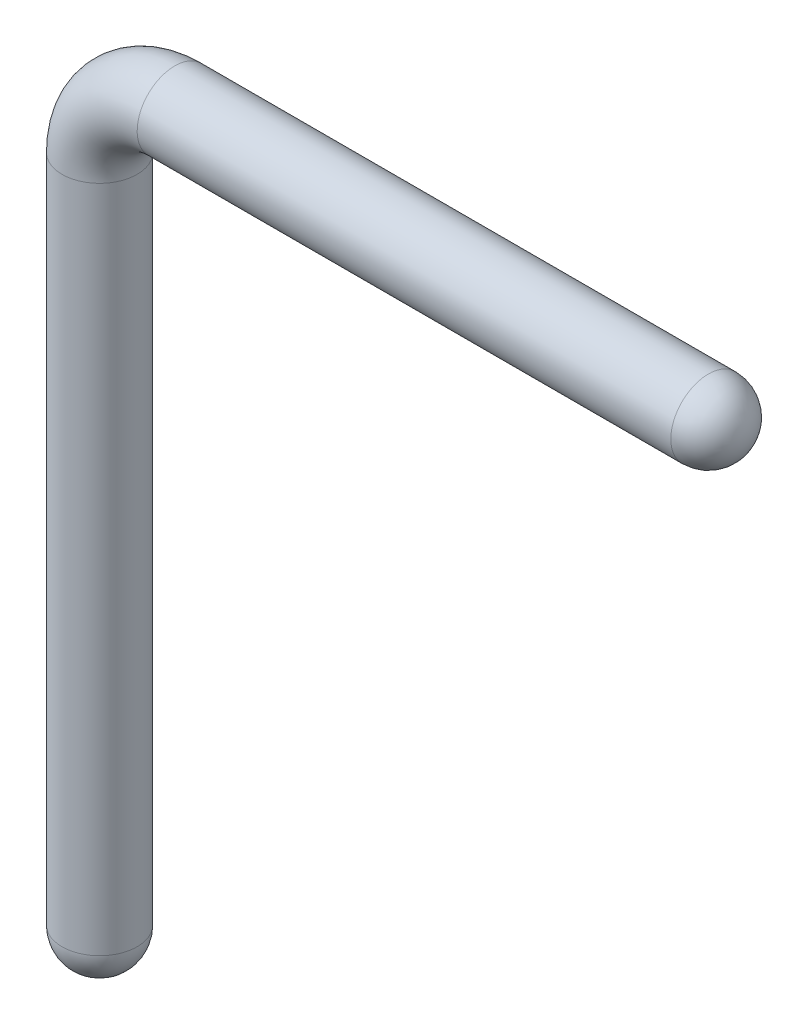
ISO-10303-21;
HEADER;
FILE_DESCRIPTION(('STEP AP214'),'2;1');
FILE_NAME('part.step','',(''),(''),'','','');
FILE_SCHEMA(('AUTOMOTIVE_DESIGN { 1 0 10303 214 1 1 1 1 }'));
ENDSEC;
DATA;
#1=APPLICATION_CONTEXT('core data for automotive mechanical design processes');
#2=APPLICATION_PROTOCOL_DEFINITION('international standard','automotive_design',2000,#1);
#3=PRODUCT_CONTEXT('',#1,'mechanical');
#4=PRODUCT('Part','Part','',(#3));
#5=PRODUCT_RELATED_PRODUCT_CATEGORY('part','',(#4));
#6=PRODUCT_DEFINITION_FORMATION('','',#4);
#7=PRODUCT_DEFINITION_CONTEXT('part definition',#1,'design');
#8=PRODUCT_DEFINITION('design','',#6,#7);
#9=PRODUCT_DEFINITION_SHAPE('','',#8);
#10=(LENGTH_UNIT() NAMED_UNIT(*) SI_UNIT(.MILLI.,.METRE.));
#11=(NAMED_UNIT(*) PLANE_ANGLE_UNIT() SI_UNIT($,.RADIAN.));
#12=(NAMED_UNIT(*) SI_UNIT($,.STERADIAN.) SOLID_ANGLE_UNIT());
#13=UNCERTAINTY_MEASURE_WITH_UNIT(LENGTH_MEASURE(1.E-05),#10,'distance_accuracy_value','');
#14=(GEOMETRIC_REPRESENTATION_CONTEXT(3) GLOBAL_UNCERTAINTY_ASSIGNED_CONTEXT((#13)) GLOBAL_UNIT_ASSIGNED_CONTEXT((#10,
#11,#12)) REPRESENTATION_CONTEXT('',''));
#15=CARTESIAN_POINT('',(0.,0.,0.));
#16=DIRECTION('',(0.,0.,1.));
#17=DIRECTION('',(1.,0.,0.));
#18=AXIS2_PLACEMENT_3D('',#15,#16,#17);
#19=CARTESIAN_POINT('',(0.,0.,0.));
#20=DIRECTION('',(0.,1.,0.));
#21=DIRECTION('',(0.,0.,1.));
#22=AXIS2_PLACEMENT_3D('',#19,#20,#21);
#23=CYLINDRICAL_SURFACE('',#22,0.25);
#24=CARTESIAN_POINT('',(0.,0.25,0.));
#25=DIRECTION('',(0.,1.,0.));
#26=DIRECTION('',(0.,0.,1.));
#27=AXIS2_PLACEMENT_3D('',#24,#25,#26);
#28=CIRCLE('',#27,0.25);
#29=CARTESIAN_POINT('',(0.,0.25,0.25));
#30=VERTEX_POINT('',#29);
#31=EDGE_CURVE('E45',#30,#30,#28,.T.);
#32=ORIENTED_EDGE('',*,*,#31,.T.);
#33=EDGE_LOOP('',(#32));
#34=FACE_BOUND('',#33,.T.);
#35=CARTESIAN_POINT('',(0.,4.7,0.));
#36=DIRECTION('',(0.,1.,0.));
#37=DIRECTION('',(0.,0.,1.));
#38=AXIS2_PLACEMENT_3D('',#35,#36,#37);
#39=CIRCLE('',#38,0.25);
#40=CARTESIAN_POINT('',(-0.25,4.7,0.));
#41=VERTEX_POINT('',#40);
#42=EDGE_CURVE('E55',#41,#41,#39,.T.);
#43=ORIENTED_EDGE('',*,*,#42,.F.);
#44=EDGE_LOOP('',(#43));
#45=FACE_BOUND('',#44,.T.);
#46=ADVANCED_FACE('F37',(#34,#45),#23,.T.);
#47=CARTESIAN_POINT('',(0.5,4.7,0.));
#48=DIRECTION('',(0.,0.,-1.));
#49=DIRECTION('',(-1.,0.,0.));
#50=AXIS2_PLACEMENT_3D('',#47,#48,#49);
#51=TOROIDAL_SURFACE('',#50,0.5,0.25);
#52=CARTESIAN_POINT('',(0.499999999999999,5.2,0.));
#53=DIRECTION('',(1.,0.,0.));
#54=DIRECTION('',(0.,0.,1.));
#55=AXIS2_PLACEMENT_3D('',#52,#53,#54);
#56=CIRCLE('',#55,0.25);
#57=CARTESIAN_POINT('',(0.499999999999999,5.45,0.));
#58=VERTEX_POINT('',#57);
#59=EDGE_CURVE('E50',#58,#58,#56,.T.);
#60=CARTESIAN_POINT('',(0.5,4.7,0.));
#61=DIRECTION('',(0.,0.,-1.));
#62=DIRECTION('',(-1.,0.,0.));
#63=AXIS2_PLACEMENT_3D('',#60,#61,#62);
#64=CIRCLE('',#63,0.75);
#65=EDGE_CURVE('',#41,#58,#64,.T.);
#66=ORIENTED_EDGE('',*,*,#42,.T.);
#67=ORIENTED_EDGE('',*,*,#59,.F.);
#68=ORIENTED_EDGE('',*,*,#65,.T.);
#69=ORIENTED_EDGE('',*,*,#65,.F.);
#70=EDGE_LOOP('',(#66,#68,#67,#69));
#71=FACE_BOUND('',#70,.T.);
#72=ADVANCED_FACE('F62',(#71),#51,.T.);
#73=CARTESIAN_POINT('',(0.5,5.2,0.));
#74=DIRECTION('',(1.,0.,0.));
#75=DIRECTION('',(0.,0.,-1.));
#76=AXIS2_PLACEMENT_3D('',#73,#74,#75);
#77=CYLINDRICAL_SURFACE('',#76,0.25);
#78=CARTESIAN_POINT('',(4.05,5.2,0.));
#79=DIRECTION('',(1.,0.,0.));
#80=DIRECTION('',(0.,0.,-1.));
#81=AXIS2_PLACEMENT_3D('',#78,#79,#80);
#82=CIRCLE('',#81,0.25);
#83=CARTESIAN_POINT('',(4.05,5.2,-0.25));
#84=VERTEX_POINT('',#83);
#85=EDGE_CURVE('E10',#84,#84,#82,.F.);
#86=ORIENTED_EDGE('',*,*,#85,.T.);
#87=EDGE_LOOP('',(#86));
#88=FACE_BOUND('',#87,.T.);
#89=ORIENTED_EDGE('',*,*,#59,.T.);
#90=EDGE_LOOP('',(#89));
#91=FACE_BOUND('',#90,.T.);
#92=ADVANCED_FACE('F70',(#88,#91),#77,.T.);
#93=CARTESIAN_POINT('',(0.,0.25,0.));
#94=DIRECTION('',(0.,1.,0.));
#95=DIRECTION('',(0.,0.,1.));
#96=AXIS2_PLACEMENT_3D('',#93,#94,#95);
#97=SPHERICAL_SURFACE('',#96,0.25);
#98=ORIENTED_EDGE('',*,*,#31,.F.);
#99=EDGE_LOOP('',(#98));
#100=FACE_BOUND('',#99,.T.);
#101=ADVANCED_FACE('F66',(#100),#97,.T.);
#102=CARTESIAN_POINT('',(4.05,5.2,0.));
#103=DIRECTION('',(1.,0.,0.));
#104=DIRECTION('',(0.,0.,-1.));
#105=AXIS2_PLACEMENT_3D('',#102,#103,#104);
#106=SPHERICAL_SURFACE('',#105,0.25);
#107=ORIENTED_EDGE('',*,*,#85,.F.);
#108=EDGE_LOOP('',(#107));
#109=FACE_BOUND('',#108,.T.);
#110=ADVANCED_FACE('F39',(#109),#106,.T.);
#111=CLOSED_SHELL('',(#46,#72,#92,#101,#110));
#112=MANIFOLD_SOLID_BREP('B2',#111);
#113=ADVANCED_BREP_SHAPE_REPRESENTATION('',(#18,#112),#14);
#114=SHAPE_DEFINITION_REPRESENTATION(#9,#113);
ENDSEC;
END-ISO-10303-21;
